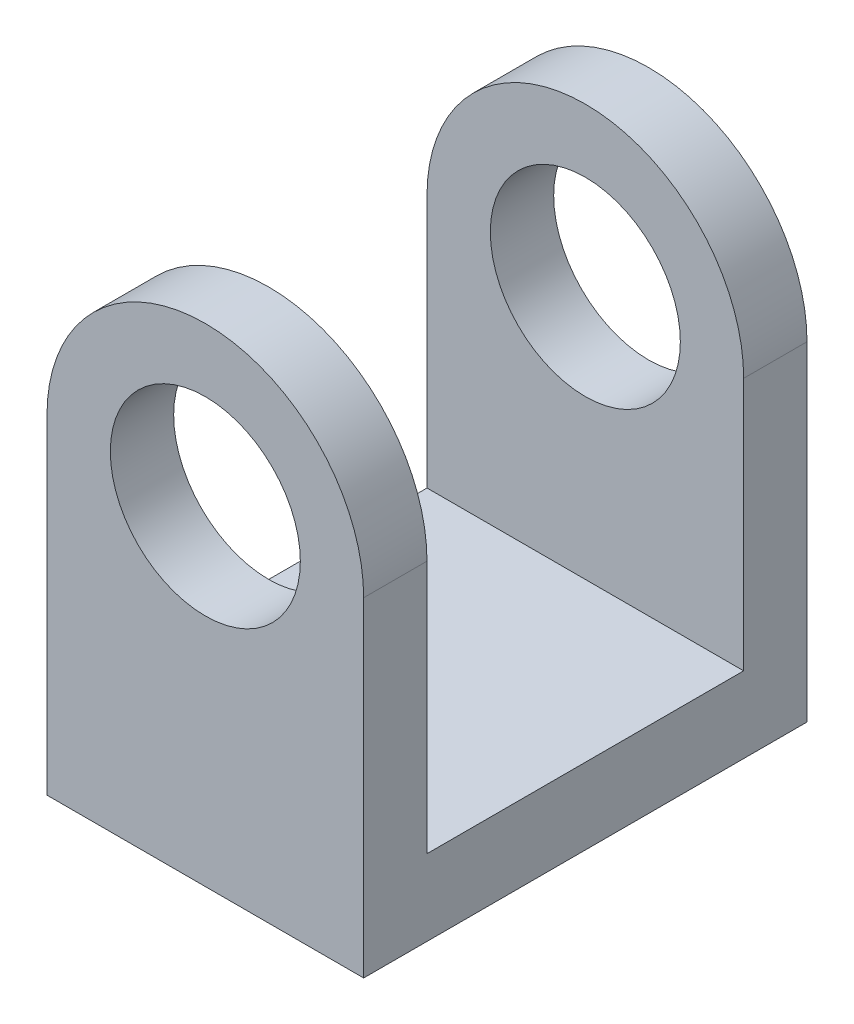
ISO-10303-21;
HEADER;
FILE_DESCRIPTION(('STEP AP214'),'2;1');
FILE_NAME('part.step','',(''),(''),'','','');
FILE_SCHEMA(('AUTOMOTIVE_DESIGN { 1 0 10303 214 1 1 1 1 }'));
ENDSEC;
DATA;
#1=APPLICATION_CONTEXT('core data for automotive mechanical design processes');
#2=APPLICATION_PROTOCOL_DEFINITION('international standard','automotive_design',2000,#1);
#3=PRODUCT_CONTEXT('',#1,'mechanical');
#4=PRODUCT('Part','Part','',(#3));
#5=PRODUCT_RELATED_PRODUCT_CATEGORY('part','',(#4));
#6=PRODUCT_DEFINITION_FORMATION('','',#4);
#7=PRODUCT_DEFINITION_CONTEXT('part definition',#1,'design');
#8=PRODUCT_DEFINITION('design','',#6,#7);
#9=PRODUCT_DEFINITION_SHAPE('','',#8);
#10=(LENGTH_UNIT() NAMED_UNIT(*) SI_UNIT(.MILLI.,.METRE.));
#11=(NAMED_UNIT(*) PLANE_ANGLE_UNIT() SI_UNIT($,.RADIAN.));
#12=(NAMED_UNIT(*) SI_UNIT($,.STERADIAN.) SOLID_ANGLE_UNIT());
#13=UNCERTAINTY_MEASURE_WITH_UNIT(LENGTH_MEASURE(1.E-05),#10,'distance_accuracy_value','');
#14=(GEOMETRIC_REPRESENTATION_CONTEXT(3) GLOBAL_UNCERTAINTY_ASSIGNED_CONTEXT((#13)) GLOBAL_UNIT_ASSIGNED_CONTEXT((#10,
#11,#12)) REPRESENTATION_CONTEXT('',''));
#15=CARTESIAN_POINT('',(0.,0.,0.));
#16=DIRECTION('',(0.,0.,1.));
#17=DIRECTION('',(1.,0.,0.));
#18=AXIS2_PLACEMENT_3D('',#15,#16,#17);
#19=CARTESIAN_POINT('',(-25.,-22.5,35.));
#20=DIRECTION('',(0.,1.,0.));
#21=DIRECTION('',(0.,0.,1.));
#22=AXIS2_PLACEMENT_3D('',#19,#20,#21);
#23=PLANE('',#22);
#24=CARTESIAN_POINT('',(0.,-22.5,0.));
#25=DIRECTION('',(0.,-1.,0.));
#26=DIRECTION('',(0.,0.,-1.));
#27=AXIS2_PLACEMENT_3D('',#24,#25,#26);
#28=CIRCLE('',#27,10.);
#29=CARTESIAN_POINT('',(0.,-22.5,-10.));
#30=VERTEX_POINT('',#29);
#31=EDGE_CURVE('E11',#30,#30,#28,.T.);
#32=ORIENTED_EDGE('',*,*,#31,.F.);
#33=EDGE_LOOP('',(#32));
#34=FACE_BOUND('',#33,.T.);
#35=CARTESIAN_POINT('',(0.,-22.5,0.));
#36=DIRECTION('',(0.,-1.,0.));
#37=DIRECTION('',(0.,0.,-1.));
#38=AXIS2_PLACEMENT_3D('',#35,#36,#37);
#39=CIRCLE('',#38,15.);
#40=CARTESIAN_POINT('',(0.,-22.5,-15.));
#41=VERTEX_POINT('',#40);
#42=EDGE_CURVE('E140',#41,#41,#39,.T.);
#43=ORIENTED_EDGE('',*,*,#42,.T.);
#44=EDGE_LOOP('',(#43));
#45=FACE_BOUND('',#44,.T.);
#46=ADVANCED_FACE('F41',(#34,#45),#23,.F.);
#47=CARTESIAN_POINT('',(0.,-37.5,0.));
#48=DIRECTION('',(0.,1.,0.));
#49=DIRECTION('',(0.,0.,1.));
#50=AXIS2_PLACEMENT_3D('',#47,#48,#49);
#51=CYLINDRICAL_SURFACE('',#50,10.);
#52=CARTESIAN_POINT('',(0.,-37.5,0.));
#53=DIRECTION('',(0.,-1.,0.));
#54=DIRECTION('',(0.,0.,-1.));
#55=AXIS2_PLACEMENT_3D('',#52,#53,#54);
#56=CIRCLE('',#55,10.);
#57=CARTESIAN_POINT('',(0.,-37.5,-10.));
#58=VERTEX_POINT('',#57);
#59=EDGE_CURVE('E146',#58,#58,#56,.T.);
#60=ORIENTED_EDGE('',*,*,#59,.F.);
#61=EDGE_LOOP('',(#60));
#62=FACE_BOUND('',#61,.T.);
#63=ORIENTED_EDGE('',*,*,#31,.T.);
#64=EDGE_LOOP('',(#63));
#65=FACE_BOUND('',#64,.T.);
#66=ADVANCED_FACE('F234',(#62,#65),#51,.T.);
#67=CARTESIAN_POINT('',(0.,-37.5,0.));
#68=DIRECTION('',(0.,-1.,0.));
#69=DIRECTION('',(0.,0.,-1.));
#70=AXIS2_PLACEMENT_3D('',#67,#68,#69);
#71=PLANE('',#70);
#72=ORIENTED_EDGE('',*,*,#59,.T.);
#73=EDGE_LOOP('',(#72));
#74=FACE_BOUND('',#73,.T.);
#75=ADVANCED_FACE('F242',(#74),#71,.T.);
#76=CARTESIAN_POINT('',(0.,-29.5,0.));
#77=DIRECTION('',(0.,-1.,0.));
#78=DIRECTION('',(0.,0.,-1.));
#79=AXIS2_PLACEMENT_3D('',#76,#77,#78);
#80=PLANE('',#79);
#81=DIRECTION('',(-1.,0.,0.));
#82=VECTOR('',#81,1.);
#83=CARTESIAN_POINT('',(25.,-29.5,35.));
#84=LINE('',#83,#82);
#85=CARTESIAN_POINT('',(25.,-29.5,35.));
#86=VERTEX_POINT('',#85);
#87=CARTESIAN_POINT('',(-25.,-29.5,35.));
#88=VERTEX_POINT('',#87);
#89=EDGE_CURVE('E115',#86,#88,#84,.T.);
#90=ORIENTED_EDGE('',*,*,#89,.T.);
#91=DIRECTION('',(0.,0.,-1.));
#92=VECTOR('',#91,1.);
#93=CARTESIAN_POINT('',(-25.,-29.5,35.));
#94=LINE('',#93,#92);
#95=CARTESIAN_POINT('',(-25.,-29.5,-35.));
#96=VERTEX_POINT('',#95);
#97=EDGE_CURVE('E123',#88,#96,#94,.T.);
#98=ORIENTED_EDGE('',*,*,#97,.T.);
#99=DIRECTION('',(1.,0.,0.));
#100=VECTOR('',#99,1.);
#101=CARTESIAN_POINT('',(-25.,-29.5,-35.));
#102=LINE('',#101,#100);
#103=CARTESIAN_POINT('',(25.,-29.5,-35.));
#104=VERTEX_POINT('',#103);
#105=EDGE_CURVE('E130',#96,#104,#102,.T.);
#106=ORIENTED_EDGE('',*,*,#105,.T.);
#107=DIRECTION('',(0.,0.,1.));
#108=VECTOR('',#107,1.);
#109=CARTESIAN_POINT('',(25.,-29.5,-35.));
#110=LINE('',#109,#108);
#111=EDGE_CURVE('E136',#104,#86,#110,.T.);
#112=ORIENTED_EDGE('',*,*,#111,.T.);
#113=EDGE_LOOP('',(#90,#98,#106,#112));
#114=FACE_BOUND('',#113,.T.);
#115=CARTESIAN_POINT('',(0.,-29.5,0.));
#116=DIRECTION('',(0.,-1.,0.));
#117=DIRECTION('',(0.,0.,-1.));
#118=AXIS2_PLACEMENT_3D('',#115,#116,#117);
#119=CIRCLE('',#118,15.);
#120=CARTESIAN_POINT('',(0.,-29.5,-15.));
#121=VERTEX_POINT('',#120);
#122=EDGE_CURVE('E137',#121,#121,#119,.T.);
#123=ORIENTED_EDGE('',*,*,#122,.F.);
#124=EDGE_LOOP('',(#123));
#125=FACE_BOUND('',#124,.T.);
#126=ADVANCED_FACE('F133',(#114,#125),#80,.T.);
#127=CARTESIAN_POINT('',(0.,-29.5,0.));
#128=DIRECTION('',(0.,1.,0.));
#129=DIRECTION('',(0.,0.,1.));
#130=AXIS2_PLACEMENT_3D('',#127,#128,#129);
#131=CYLINDRICAL_SURFACE('',#130,15.);
#132=ORIENTED_EDGE('',*,*,#122,.T.);
#133=EDGE_LOOP('',(#132));
#134=FACE_BOUND('',#133,.T.);
#135=ORIENTED_EDGE('',*,*,#42,.F.);
#136=EDGE_LOOP('',(#135));
#137=FACE_BOUND('',#136,.T.);
#138=ADVANCED_FACE('F258',(#134,#137),#131,.F.);
#139=CARTESIAN_POINT('',(0.,22.5,35.));
#140=DIRECTION('',(0.,0.,-1.));
#141=DIRECTION('',(-1.,0.,0.));
#142=AXIS2_PLACEMENT_3D('',#139,#140,#141);
#143=CYLINDRICAL_SURFACE('',#142,15.);
#144=CARTESIAN_POINT('',(0.,22.5,35.));
#145=DIRECTION('',(0.,0.,1.));
#146=DIRECTION('',(1.,0.,0.));
#147=AXIS2_PLACEMENT_3D('',#144,#145,#146);
#148=CIRCLE('',#147,15.);
#149=CARTESIAN_POINT('',(15.,22.5,35.));
#150=VERTEX_POINT('',#149);
#151=EDGE_CURVE('E177',#150,#150,#148,.T.);
#152=ORIENTED_EDGE('',*,*,#151,.T.);
#153=EDGE_LOOP('',(#152));
#154=FACE_BOUND('',#153,.T.);
#155=CARTESIAN_POINT('',(0.,22.5,25.));
#156=DIRECTION('',(0.,0.,1.));
#157=DIRECTION('',(1.,0.,0.));
#158=AXIS2_PLACEMENT_3D('',#155,#156,#157);
#159=CIRCLE('',#158,15.);
#160=CARTESIAN_POINT('',(15.,22.5,25.));
#161=VERTEX_POINT('',#160);
#162=EDGE_CURVE('E176',#161,#161,#159,.T.);
#163=ORIENTED_EDGE('',*,*,#162,.F.);
#164=EDGE_LOOP('',(#163));
#165=FACE_BOUND('',#164,.T.);
#166=ADVANCED_FACE('F253',(#154,#165),#143,.F.);
#167=CARTESIAN_POINT('',(0.,22.5,35.));
#168=DIRECTION('',(0.,0.,-1.));
#169=DIRECTION('',(-1.,0.,0.));
#170=AXIS2_PLACEMENT_3D('',#167,#168,#169);
#171=CYLINDRICAL_SURFACE('',#170,25.);
#172=CARTESIAN_POINT('',(0.,22.5,25.));
#173=DIRECTION('',(0.,0.,1.));
#174=DIRECTION('',(-1.,0.,0.));
#175=AXIS2_PLACEMENT_3D('',#172,#173,#174);
#176=CIRCLE('',#175,25.);
#177=CARTESIAN_POINT('',(25.,22.5,25.));
#178=VERTEX_POINT('',#177);
#179=CARTESIAN_POINT('',(-25.,22.5,25.));
#180=VERTEX_POINT('',#179);
#181=EDGE_CURVE('E188',#178,#180,#176,.T.);
#182=ORIENTED_EDGE('',*,*,#181,.T.);
#183=DIRECTION('',(0.,0.,-1.));
#184=VECTOR('',#183,1.);
#185=CARTESIAN_POINT('',(-25.,22.5,35.));
#186=LINE('',#185,#184);
#187=CARTESIAN_POINT('',(-25.,22.5,35.));
#188=VERTEX_POINT('',#187);
#189=EDGE_CURVE('E120',#188,#180,#186,.T.);
#190=ORIENTED_EDGE('',*,*,#189,.F.);
#191=CARTESIAN_POINT('',(0.,22.5,35.));
#192=DIRECTION('',(0.,0.,1.));
#193=DIRECTION('',(-1.,0.,0.));
#194=AXIS2_PLACEMENT_3D('',#191,#192,#193);
#195=CIRCLE('',#194,25.);
#196=CARTESIAN_POINT('',(25.,22.5,35.));
#197=VERTEX_POINT('',#196);
#198=EDGE_CURVE('E116',#197,#188,#195,.T.);
#199=ORIENTED_EDGE('',*,*,#198,.F.);
#200=DIRECTION('',(0.,0.,-1.));
#201=VECTOR('',#200,1.);
#202=CARTESIAN_POINT('',(25.,22.5,35.));
#203=LINE('',#202,#201);
#204=EDGE_CURVE('E192',#197,#178,#203,.T.);
#205=ORIENTED_EDGE('',*,*,#204,.T.);
#206=EDGE_LOOP('',(#182,#190,#199,#205));
#207=FACE_BOUND('',#206,.T.);
#208=ADVANCED_FACE('F251',(#207),#171,.T.);
#209=CARTESIAN_POINT('',(0.,22.5,25.));
#210=DIRECTION('',(0.,0.,-1.));
#211=DIRECTION('',(-1.,0.,0.));
#212=AXIS2_PLACEMENT_3D('',#209,#210,#211);
#213=PLANE('',#212);
#214=DIRECTION('',(1.,0.,0.));
#215=VECTOR('',#214,1.);
#216=CARTESIAN_POINT('',(25.,-17.5,25.));
#217=LINE('',#216,#215);
#218=CARTESIAN_POINT('',(-25.,-17.5,25.));
#219=VERTEX_POINT('',#218);
#220=CARTESIAN_POINT('',(25.,-17.5,25.));
#221=VERTEX_POINT('',#220);
#222=EDGE_CURVE('E168',#219,#221,#217,.T.);
#223=ORIENTED_EDGE('',*,*,#222,.F.);
#224=DIRECTION('',(0.,-1.,0.));
#225=VECTOR('',#224,1.);
#226=CARTESIAN_POINT('',(-25.,22.5,25.));
#227=LINE('',#226,#225);
#228=EDGE_CURVE('E185',#180,#219,#227,.T.);
#229=ORIENTED_EDGE('',*,*,#228,.F.);
#230=ORIENTED_EDGE('',*,*,#181,.F.);
#231=DIRECTION('',(0.,1.,0.));
#232=VECTOR('',#231,1.);
#233=CARTESIAN_POINT('',(25.,22.5,25.));
#234=LINE('',#233,#232);
#235=EDGE_CURVE('E180',#221,#178,#234,.T.);
#236=ORIENTED_EDGE('',*,*,#235,.F.);
#237=EDGE_LOOP('',(#223,#229,#230,#236));
#238=FACE_BOUND('',#237,.T.);
#239=ORIENTED_EDGE('',*,*,#162,.T.);
#240=EDGE_LOOP('',(#239));
#241=FACE_BOUND('',#240,.T.);
#242=ADVANCED_FACE('F202',(#238,#241),#213,.T.);
#243=CARTESIAN_POINT('',(25.,-17.5,-35.));
#244=DIRECTION('',(0.,-1.,0.));
#245=DIRECTION('',(0.,0.,-1.));
#246=AXIS2_PLACEMENT_3D('',#243,#244,#245);
#247=PLANE('',#246);
#248=DIRECTION('',(0.,0.,1.));
#249=VECTOR('',#248,1.);
#250=CARTESIAN_POINT('',(25.,-17.5,-35.));
#251=LINE('',#250,#249);
#252=CARTESIAN_POINT('',(25.,-17.5,-25.));
#253=VERTEX_POINT('',#252);
#254=EDGE_CURVE('E172',#253,#221,#251,.T.);
#255=ORIENTED_EDGE('',*,*,#254,.F.);
#256=DIRECTION('',(-1.,0.,0.));
#257=VECTOR('',#256,1.);
#258=CARTESIAN_POINT('',(25.,-17.5,-25.));
#259=LINE('',#258,#257);
#260=CARTESIAN_POINT('',(-25.,-17.5,-25.));
#261=VERTEX_POINT('',#260);
#262=EDGE_CURVE('E45',#253,#261,#259,.T.);
#263=ORIENTED_EDGE('',*,*,#262,.T.);
#264=DIRECTION('',(0.,0.,1.));
#265=VECTOR('',#264,1.);
#266=CARTESIAN_POINT('',(-25.,-17.5,-35.));
#267=LINE('',#266,#265);
#268=EDGE_CURVE('E64',#261,#219,#267,.T.);
#269=ORIENTED_EDGE('',*,*,#268,.T.);
#270=ORIENTED_EDGE('',*,*,#222,.T.);
#271=EDGE_LOOP('',(#255,#263,#269,#270));
#272=FACE_BOUND('',#271,.T.);
#273=ADVANCED_FACE('F197',(#272),#247,.F.);
#274=CARTESIAN_POINT('',(0.,22.5,-25.));
#275=DIRECTION('',(0.,0.,1.));
#276=DIRECTION('',(-1.,0.,0.));
#277=AXIS2_PLACEMENT_3D('',#274,#275,#276);
#278=PLANE('',#277);
#279=CARTESIAN_POINT('',(0.,22.5,-25.));
#280=DIRECTION('',(0.,0.,1.));
#281=DIRECTION('',(1.,0.,0.));
#282=AXIS2_PLACEMENT_3D('',#279,#280,#281);
#283=CIRCLE('',#282,15.);
#284=CARTESIAN_POINT('',(15.,22.5,-25.));
#285=VERTEX_POINT('',#284);
#286=EDGE_CURVE('E148',#285,#285,#283,.T.);
#287=ORIENTED_EDGE('',*,*,#286,.F.);
#288=EDGE_LOOP('',(#287));
#289=FACE_BOUND('',#288,.T.);
#290=ORIENTED_EDGE('',*,*,#262,.F.);
#291=DIRECTION('',(0.,1.,0.));
#292=VECTOR('',#291,1.);
#293=CARTESIAN_POINT('',(25.,22.5,-25.));
#294=LINE('',#293,#292);
#295=CARTESIAN_POINT('',(25.,22.5,-25.));
#296=VERTEX_POINT('',#295);
#297=EDGE_CURVE('E153',#253,#296,#294,.T.);
#298=ORIENTED_EDGE('',*,*,#297,.T.);
#299=CARTESIAN_POINT('',(0.,22.5,-25.));
#300=DIRECTION('',(0.,0.,1.));
#301=DIRECTION('',(-1.,0.,0.));
#302=AXIS2_PLACEMENT_3D('',#299,#300,#301);
#303=CIRCLE('',#302,25.);
#304=CARTESIAN_POINT('',(-25.,22.5,-25.));
#305=VERTEX_POINT('',#304);
#306=EDGE_CURVE('E160',#296,#305,#303,.T.);
#307=ORIENTED_EDGE('',*,*,#306,.T.);
#308=DIRECTION('',(0.,-1.,0.));
#309=VECTOR('',#308,1.);
#310=CARTESIAN_POINT('',(-25.,22.5,-25.));
#311=LINE('',#310,#309);
#312=EDGE_CURVE('E57',#305,#261,#311,.T.);
#313=ORIENTED_EDGE('',*,*,#312,.T.);
#314=EDGE_LOOP('',(#290,#298,#307,#313));
#315=FACE_BOUND('',#314,.T.);
#316=ADVANCED_FACE('F208',(#289,#315),#278,.T.);
#317=CARTESIAN_POINT('',(0.,22.5,-35.));
#318=DIRECTION('',(0.,0.,1.));
#319=DIRECTION('',(1.,0.,0.));
#320=AXIS2_PLACEMENT_3D('',#317,#318,#319);
#321=CYLINDRICAL_SURFACE('',#320,15.);
#322=CARTESIAN_POINT('',(0.,22.5,-35.));
#323=DIRECTION('',(0.,0.,1.));
#324=DIRECTION('',(1.,0.,0.));
#325=AXIS2_PLACEMENT_3D('',#322,#323,#324);
#326=CIRCLE('',#325,15.);
#327=CARTESIAN_POINT('',(15.,22.5,-35.));
#328=VERTEX_POINT('',#327);
#329=EDGE_CURVE('E150',#328,#328,#326,.T.);
#330=ORIENTED_EDGE('',*,*,#329,.F.);
#331=EDGE_LOOP('',(#330));
#332=FACE_BOUND('',#331,.T.);
#333=ORIENTED_EDGE('',*,*,#286,.T.);
#334=EDGE_LOOP('',(#333));
#335=FACE_BOUND('',#334,.T.);
#336=ADVANCED_FACE('F219',(#332,#335),#321,.F.);
#337=CARTESIAN_POINT('',(0.,22.5,-35.));
#338=DIRECTION('',(0.,0.,1.));
#339=DIRECTION('',(1.,0.,0.));
#340=AXIS2_PLACEMENT_3D('',#337,#338,#339);
#341=CYLINDRICAL_SURFACE('',#340,25.);
#342=ORIENTED_EDGE('',*,*,#306,.F.);
#343=DIRECTION('',(0.,0.,1.));
#344=VECTOR('',#343,1.);
#345=CARTESIAN_POINT('',(25.,22.5,-35.));
#346=LINE('',#345,#344);
#347=CARTESIAN_POINT('',(25.,22.5,-35.));
#348=VERTEX_POINT('',#347);
#349=EDGE_CURVE('E159',#348,#296,#346,.T.);
#350=ORIENTED_EDGE('',*,*,#349,.F.);
#351=CARTESIAN_POINT('',(0.,22.5,-35.));
#352=DIRECTION('',(0.,0.,1.));
#353=DIRECTION('',(-1.,0.,0.));
#354=AXIS2_PLACEMENT_3D('',#351,#352,#353);
#355=CIRCLE('',#354,25.);
#356=CARTESIAN_POINT('',(-25.,22.5,-35.));
#357=VERTEX_POINT('',#356);
#358=EDGE_CURVE('E156',#348,#357,#355,.T.);
#359=ORIENTED_EDGE('',*,*,#358,.T.);
#360=DIRECTION('',(0.,0.,1.));
#361=VECTOR('',#360,1.);
#362=CARTESIAN_POINT('',(-25.,22.5,-35.));
#363=LINE('',#362,#361);
#364=EDGE_CURVE('E166',#357,#305,#363,.T.);
#365=ORIENTED_EDGE('',*,*,#364,.T.);
#366=EDGE_LOOP('',(#342,#350,#359,#365));
#367=FACE_BOUND('',#366,.T.);
#368=ADVANCED_FACE('F210',(#367),#341,.T.);
#369=CARTESIAN_POINT('',(0.,0.,-35.));
#370=DIRECTION('',(0.,0.,1.));
#371=DIRECTION('',(1.,0.,0.));
#372=AXIS2_PLACEMENT_3D('',#369,#370,#371);
#373=PLANE('',#372);
#374=DIRECTION('',(0.,-1.,0.));
#375=VECTOR('',#374,1.);
#376=CARTESIAN_POINT('',(25.,-22.5,-35.));
#377=LINE('',#376,#375);
#378=EDGE_CURVE('E169',#348,#104,#377,.T.);
#379=ORIENTED_EDGE('',*,*,#378,.T.);
#380=ORIENTED_EDGE('',*,*,#105,.F.);
#381=DIRECTION('',(0.,1.,0.));
#382=VECTOR('',#381,1.);
#383=CARTESIAN_POINT('',(-25.,-22.5,-35.));
#384=LINE('',#383,#382);
#385=EDGE_CURVE('E126',#96,#357,#384,.T.);
#386=ORIENTED_EDGE('',*,*,#385,.T.);
#387=ORIENTED_EDGE('',*,*,#358,.F.);
#388=EDGE_LOOP('',(#379,#380,#386,#387));
#389=FACE_BOUND('',#388,.T.);
#390=ORIENTED_EDGE('',*,*,#329,.T.);
#391=EDGE_LOOP('',(#390));
#392=FACE_BOUND('',#391,.T.);
#393=ADVANCED_FACE('F213',(#389,#392),#373,.F.);
#394=CARTESIAN_POINT('',(25.,22.5,35.));
#395=DIRECTION('',(-1.,0.,0.));
#396=DIRECTION('',(0.,0.,1.));
#397=AXIS2_PLACEMENT_3D('',#394,#395,#396);
#398=PLANE('',#397);
#399=DIRECTION('',(0.,1.,0.));
#400=VECTOR('',#399,1.);
#401=CARTESIAN_POINT('',(25.,22.5,35.));
#402=LINE('',#401,#400);
#403=EDGE_CURVE('E183',#86,#197,#402,.T.);
#404=ORIENTED_EDGE('',*,*,#403,.F.);
#405=ORIENTED_EDGE('',*,*,#111,.F.);
#406=ORIENTED_EDGE('',*,*,#378,.F.);
#407=ORIENTED_EDGE('',*,*,#349,.T.);
#408=ORIENTED_EDGE('',*,*,#297,.F.);
#409=ORIENTED_EDGE('',*,*,#254,.T.);
#410=ORIENTED_EDGE('',*,*,#235,.T.);
#411=ORIENTED_EDGE('',*,*,#204,.F.);
#412=EDGE_LOOP('',(#404,#405,#406,#407,#408,#409,#410,#411));
#413=FACE_BOUND('',#412,.T.);
#414=ADVANCED_FACE('F43',(#413),#398,.F.);
#415=CARTESIAN_POINT('',(-25.,22.5,35.));
#416=DIRECTION('',(1.,0.,0.));
#417=DIRECTION('',(0.,1.,0.));
#418=AXIS2_PLACEMENT_3D('',#415,#416,#417);
#419=PLANE('',#418);
#420=ORIENTED_EDGE('',*,*,#268,.F.);
#421=ORIENTED_EDGE('',*,*,#312,.F.);
#422=ORIENTED_EDGE('',*,*,#364,.F.);
#423=ORIENTED_EDGE('',*,*,#385,.F.);
#424=ORIENTED_EDGE('',*,*,#97,.F.);
#425=DIRECTION('',(0.,-1.,0.));
#426=VECTOR('',#425,1.);
#427=CARTESIAN_POINT('',(-25.,22.5,35.));
#428=LINE('',#427,#426);
#429=EDGE_CURVE('E109',#188,#88,#428,.T.);
#430=ORIENTED_EDGE('',*,*,#429,.F.);
#431=ORIENTED_EDGE('',*,*,#189,.T.);
#432=ORIENTED_EDGE('',*,*,#228,.T.);
#433=EDGE_LOOP('',(#420,#421,#422,#423,#424,#430,#431,#432));
#434=FACE_BOUND('',#433,.T.);
#435=ADVANCED_FACE('F124',(#434),#419,.F.);
#436=CARTESIAN_POINT('',(0.,22.5,35.));
#437=DIRECTION('',(0.,0.,-1.));
#438=DIRECTION('',(-1.,0.,0.));
#439=AXIS2_PLACEMENT_3D('',#436,#437,#438);
#440=PLANE('',#439);
#441=ORIENTED_EDGE('',*,*,#403,.T.);
#442=ORIENTED_EDGE('',*,*,#198,.T.);
#443=ORIENTED_EDGE('',*,*,#429,.T.);
#444=ORIENTED_EDGE('',*,*,#89,.F.);
#445=EDGE_LOOP('',(#441,#442,#443,#444));
#446=FACE_BOUND('',#445,.T.);
#447=ORIENTED_EDGE('',*,*,#151,.F.);
#448=EDGE_LOOP('',(#447));
#449=FACE_BOUND('',#448,.T.);
#450=ADVANCED_FACE('F112',(#446,#449),#440,.F.);
#451=CLOSED_SHELL('',(#46,#66,#75,#126,#138,#166,#208,#242,#273,#316,#336,#368,#393,#414,#435,#450));
#452=MANIFOLD_SOLID_BREP('B2',#451);
#453=ADVANCED_BREP_SHAPE_REPRESENTATION('',(#18,#452),#14);
#454=SHAPE_DEFINITION_REPRESENTATION(#9,#453);
ENDSEC;
END-ISO-10303-21;
